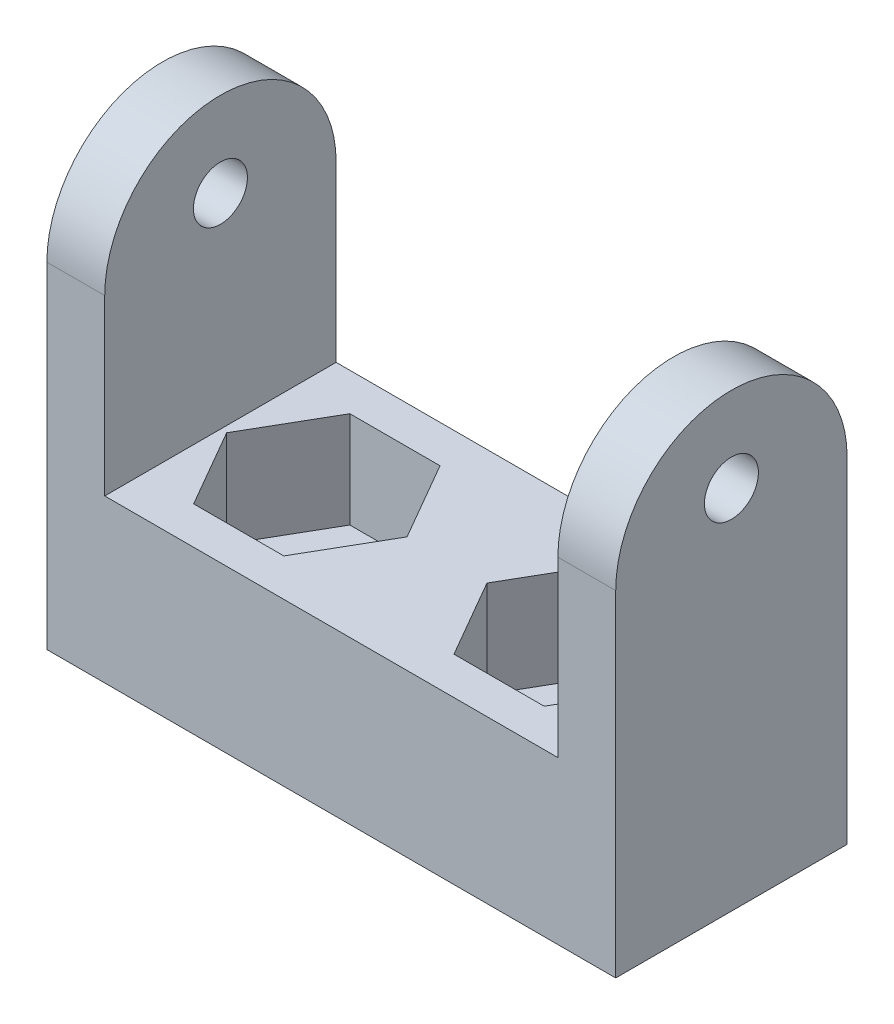
ISO-10303-21;
HEADER;
FILE_DESCRIPTION(('STEP AP214'),'2;1');
FILE_NAME('part.step','',(''),(''),'','','');
FILE_SCHEMA(('AUTOMOTIVE_DESIGN { 1 0 10303 214 1 1 1 1 }'));
ENDSEC;
DATA;
#1=APPLICATION_CONTEXT('core data for automotive mechanical design processes');
#2=APPLICATION_PROTOCOL_DEFINITION('international standard','automotive_design',2000,#1);
#3=PRODUCT_CONTEXT('',#1,'mechanical');
#4=PRODUCT('Part','Part','',(#3));
#5=PRODUCT_RELATED_PRODUCT_CATEGORY('part','',(#4));
#6=PRODUCT_DEFINITION_FORMATION('','',#4);
#7=PRODUCT_DEFINITION_CONTEXT('part definition',#1,'design');
#8=PRODUCT_DEFINITION('design','',#6,#7);
#9=PRODUCT_DEFINITION_SHAPE('','',#8);
#10=(LENGTH_UNIT() NAMED_UNIT(*) SI_UNIT(.MILLI.,.METRE.));
#11=(NAMED_UNIT(*) PLANE_ANGLE_UNIT() SI_UNIT($,.RADIAN.));
#12=(NAMED_UNIT(*) SI_UNIT($,.STERADIAN.) SOLID_ANGLE_UNIT());
#13=UNCERTAINTY_MEASURE_WITH_UNIT(LENGTH_MEASURE(1.E-05),#10,'distance_accuracy_value','');
#14=(GEOMETRIC_REPRESENTATION_CONTEXT(3) GLOBAL_UNCERTAINTY_ASSIGNED_CONTEXT((#13)) GLOBAL_UNIT_ASSIGNED_CONTEXT((#10,
#11,#12)) REPRESENTATION_CONTEXT('',''));
#15=CARTESIAN_POINT('',(0.,0.,0.));
#16=DIRECTION('',(0.,0.,1.));
#17=DIRECTION('',(1.,0.,0.));
#18=AXIS2_PLACEMENT_3D('',#15,#16,#17);
#19=CARTESIAN_POINT('',(0.,8.4,0.));
#20=DIRECTION('',(0.,1.,0.));
#21=DIRECTION('',(0.,0.,1.));
#22=AXIS2_PLACEMENT_3D('',#19,#20,#21);
#23=PLANE('',#22);
#24=DIRECTION('',(-1.,0.,0.));
#25=VECTOR('',#24,1.);
#26=CARTESIAN_POINT('',(-4.41173140978202,8.4,4.05));
#27=LINE('',#26,#25);
#28=CARTESIAN_POINT('',(-4.41173140978202,8.4,4.05));
#29=VERTEX_POINT('',#28);
#30=CARTESIAN_POINT('',(-9.08826859021799,8.4,4.05));
#31=VERTEX_POINT('',#30);
#32=EDGE_CURVE('E210',#29,#31,#27,.T.);
#33=ORIENTED_EDGE('',*,*,#32,.T.);
#34=DIRECTION('',(-0.5,0.,-0.866025403784439));
#35=VECTOR('',#34,1.);
#36=CARTESIAN_POINT('',(-9.08826859021799,8.4,4.05));
#37=LINE('',#36,#35);
#38=CARTESIAN_POINT('',(-11.426537180436,8.4,0.));
#39=VERTEX_POINT('',#38);
#40=EDGE_CURVE('E61',#31,#39,#37,.T.);
#41=ORIENTED_EDGE('',*,*,#40,.T.);
#42=DIRECTION('',(0.5,0.,-0.866025403784438));
#43=VECTOR('',#42,1.);
#44=CARTESIAN_POINT('',(-11.426537180436,8.4,0.));
#45=LINE('',#44,#43);
#46=CARTESIAN_POINT('',(-9.08826859021799,8.4,-4.05));
#47=VERTEX_POINT('',#46);
#48=EDGE_CURVE('E222',#39,#47,#45,.T.);
#49=ORIENTED_EDGE('',*,*,#48,.T.);
#50=DIRECTION('',(1.,0.,0.));
#51=VECTOR('',#50,1.);
#52=CARTESIAN_POINT('',(-9.08826859021799,8.4,-4.05));
#53=LINE('',#52,#51);
#54=CARTESIAN_POINT('',(-4.41173140978202,8.4,-4.05));
#55=VERTEX_POINT('',#54);
#56=EDGE_CURVE('E225',#47,#55,#53,.T.);
#57=ORIENTED_EDGE('',*,*,#56,.T.);
#58=DIRECTION('',(0.5,0.,0.866025403784439));
#59=VECTOR('',#58,1.);
#60=CARTESIAN_POINT('',(-4.41173140978202,8.4,-4.05));
#61=LINE('',#60,#59);
#62=CARTESIAN_POINT('',(-2.07346281956403,8.4,0.));
#63=VERTEX_POINT('',#62);
#64=EDGE_CURVE('E228',#55,#63,#61,.T.);
#65=ORIENTED_EDGE('',*,*,#64,.T.);
#66=DIRECTION('',(-0.5,0.,0.866025403784439));
#67=VECTOR('',#66,1.);
#68=CARTESIAN_POINT('',(-2.07346281956403,8.4,0.));
#69=LINE('',#68,#67);
#70=EDGE_CURVE('E231',#63,#29,#69,.T.);
#71=ORIENTED_EDGE('',*,*,#70,.T.);
#72=EDGE_LOOP('',(#33,#41,#49,#57,#65,#71));
#73=FACE_BOUND('',#72,.T.);
#74=DIRECTION('',(0.,0.,1.));
#75=VECTOR('',#74,1.);
#76=CARTESIAN_POINT('',(-11.75,8.4,6.));
#77=LINE('',#76,#75);
#78=CARTESIAN_POINT('',(-11.75,8.4,-6.));
#79=VERTEX_POINT('',#78);
#80=CARTESIAN_POINT('',(-11.75,8.4,6.));
#81=VERTEX_POINT('',#80);
#82=EDGE_CURVE('E263',#79,#81,#77,.T.);
#83=ORIENTED_EDGE('',*,*,#82,.T.);
#84=DIRECTION('',(1.,0.,0.));
#85=VECTOR('',#84,1.);
#86=CARTESIAN_POINT('',(11.75,8.4,6.));
#87=LINE('',#86,#85);
#88=CARTESIAN_POINT('',(11.75,8.4,6.));
#89=VERTEX_POINT('',#88);
#90=EDGE_CURVE('E266',#81,#89,#87,.T.);
#91=ORIENTED_EDGE('',*,*,#90,.T.);
#92=DIRECTION('',(0.,0.,-1.));
#93=VECTOR('',#92,1.);
#94=CARTESIAN_POINT('',(11.75,8.4,6.));
#95=LINE('',#94,#93);
#96=CARTESIAN_POINT('',(11.75,8.4,-6.));
#97=VERTEX_POINT('',#96);
#98=EDGE_CURVE('E269',#89,#97,#95,.T.);
#99=ORIENTED_EDGE('',*,*,#98,.T.);
#100=DIRECTION('',(-1.,0.,0.));
#101=VECTOR('',#100,1.);
#102=CARTESIAN_POINT('',(11.75,8.4,-6.));
#103=LINE('',#102,#101);
#104=EDGE_CURVE('E272',#97,#79,#103,.T.);
#105=ORIENTED_EDGE('',*,*,#104,.T.);
#106=EDGE_LOOP('',(#83,#91,#99,#105));
#107=FACE_BOUND('',#106,.T.);
#108=DIRECTION('',(-1.,0.,0.));
#109=VECTOR('',#108,1.);
#110=CARTESIAN_POINT('',(9.08826859021798,8.4,4.05));
#111=LINE('',#110,#109);
#112=CARTESIAN_POINT('',(9.08826859021798,8.4,4.05));
#113=VERTEX_POINT('',#112);
#114=CARTESIAN_POINT('',(4.41173140978201,8.4,4.05));
#115=VERTEX_POINT('',#114);
#116=EDGE_CURVE('E193',#113,#115,#111,.T.);
#117=ORIENTED_EDGE('',*,*,#116,.T.);
#118=DIRECTION('',(-0.5,0.,-0.866025403784439));
#119=VECTOR('',#118,1.);
#120=CARTESIAN_POINT('',(4.41173140978201,8.4,4.05));
#121=LINE('',#120,#119);
#122=CARTESIAN_POINT('',(2.07346281956403,8.4,0.));
#123=VERTEX_POINT('',#122);
#124=EDGE_CURVE('E53',#115,#123,#121,.T.);
#125=ORIENTED_EDGE('',*,*,#124,.T.);
#126=DIRECTION('',(0.5,0.,-0.866025403784439));
#127=VECTOR('',#126,1.);
#128=CARTESIAN_POINT('',(2.07346281956403,8.4,0.));
#129=LINE('',#128,#127);
#130=CARTESIAN_POINT('',(4.41173140978201,8.4,-4.05));
#131=VERTEX_POINT('',#130);
#132=EDGE_CURVE('E197',#123,#131,#129,.T.);
#133=ORIENTED_EDGE('',*,*,#132,.T.);
#134=DIRECTION('',(1.,0.,0.));
#135=VECTOR('',#134,1.);
#136=CARTESIAN_POINT('',(4.41173140978201,8.4,-4.05));
#137=LINE('',#136,#135);
#138=CARTESIAN_POINT('',(9.08826859021798,8.4,-4.05));
#139=VERTEX_POINT('',#138);
#140=EDGE_CURVE('E653',#131,#139,#137,.T.);
#141=ORIENTED_EDGE('',*,*,#140,.T.);
#142=DIRECTION('',(0.5,0.,0.866025403784439));
#143=VECTOR('',#142,1.);
#144=CARTESIAN_POINT('',(9.08826859021798,8.4,-4.05));
#145=LINE('',#144,#143);
#146=CARTESIAN_POINT('',(11.426537180436,8.4,0.));
#147=VERTEX_POINT('',#146);
#148=EDGE_CURVE('E650',#139,#147,#145,.T.);
#149=ORIENTED_EDGE('',*,*,#148,.T.);
#150=DIRECTION('',(-0.5,0.,0.866025403784439));
#151=VECTOR('',#150,1.);
#152=CARTESIAN_POINT('',(11.426537180436,8.4,0.));
#153=LINE('',#152,#151);
#154=EDGE_CURVE('E644',#147,#113,#153,.T.);
#155=ORIENTED_EDGE('',*,*,#154,.T.);
#156=EDGE_LOOP('',(#117,#125,#133,#141,#149,#155));
#157=FACE_BOUND('',#156,.T.);
#158=ADVANCED_FACE('F35',(#73,#107,#157),#23,.T.);
#159=CARTESIAN_POINT('',(0.,0.,0.));
#160=DIRECTION('',(0.,1.,0.));
#161=DIRECTION('',(0.,0.,1.));
#162=AXIS2_PLACEMENT_3D('',#159,#160,#161);
#163=PLANE('',#162);
#164=DIRECTION('',(0.,0.,-1.));
#165=VECTOR('',#164,1.);
#166=CARTESIAN_POINT('',(14.75,0.,-6.));
#167=LINE('',#166,#165);
#168=CARTESIAN_POINT('',(14.75,0.,6.));
#169=VERTEX_POINT('',#168);
#170=CARTESIAN_POINT('',(14.75,0.,-6.));
#171=VERTEX_POINT('',#170);
#172=EDGE_CURVE('E279',#169,#171,#167,.T.);
#173=ORIENTED_EDGE('',*,*,#172,.F.);
#174=DIRECTION('',(1.,0.,0.));
#175=VECTOR('',#174,1.);
#176=CARTESIAN_POINT('',(-14.75,0.,6.));
#177=LINE('',#176,#175);
#178=CARTESIAN_POINT('',(-14.75,0.,6.));
#179=VERTEX_POINT('',#178);
#180=EDGE_CURVE('E296',#179,#169,#177,.T.);
#181=ORIENTED_EDGE('',*,*,#180,.F.);
#182=DIRECTION('',(0.,0.,1.));
#183=VECTOR('',#182,1.);
#184=CARTESIAN_POINT('',(-14.75,0.,-6.));
#185=LINE('',#184,#183);
#186=CARTESIAN_POINT('',(-14.75,0.,-6.));
#187=VERTEX_POINT('',#186);
#188=EDGE_CURVE('E293',#187,#179,#185,.T.);
#189=ORIENTED_EDGE('',*,*,#188,.F.);
#190=DIRECTION('',(-1.,0.,0.));
#191=VECTOR('',#190,1.);
#192=CARTESIAN_POINT('',(-14.75,0.,-6.));
#193=LINE('',#192,#191);
#194=EDGE_CURVE('E290',#171,#187,#193,.T.);
#195=ORIENTED_EDGE('',*,*,#194,.F.);
#196=EDGE_LOOP('',(#173,#181,#189,#195));
#197=FACE_BOUND('',#196,.T.);
#198=CARTESIAN_POINT('',(-6.75,0.,0.));
#199=DIRECTION('',(0.,-1.,0.));
#200=DIRECTION('',(0.,0.,-1.));
#201=AXIS2_PLACEMENT_3D('',#198,#199,#200);
#202=CIRCLE('',#201,2.64999999999999);
#203=CARTESIAN_POINT('',(-6.75,0.,-2.64999999999999));
#204=VERTEX_POINT('',#203);
#205=EDGE_CURVE('E250',#204,#204,#202,.T.);
#206=ORIENTED_EDGE('',*,*,#205,.F.);
#207=EDGE_LOOP('',(#206));
#208=FACE_BOUND('',#207,.T.);
#209=CARTESIAN_POINT('',(6.75,0.,0.));
#210=DIRECTION('',(0.,-1.,0.));
#211=DIRECTION('',(0.,0.,-1.));
#212=AXIS2_PLACEMENT_3D('',#209,#210,#211);
#213=CIRCLE('',#212,2.64999999999999);
#214=CARTESIAN_POINT('',(6.75,0.,-2.64999999999999));
#215=VERTEX_POINT('',#214);
#216=EDGE_CURVE('E247',#215,#215,#213,.T.);
#217=ORIENTED_EDGE('',*,*,#216,.F.);
#218=EDGE_LOOP('',(#217));
#219=FACE_BOUND('',#218,.T.);
#220=ADVANCED_FACE('F350',(#197,#208,#219),#163,.F.);
#221=CARTESIAN_POINT('',(11.75,17.4,0.));
#222=DIRECTION('',(-1.,0.,0.));
#223=DIRECTION('',(0.,0.,1.));
#224=AXIS2_PLACEMENT_3D('',#221,#222,#223);
#225=CYLINDRICAL_SURFACE('',#224,6.);
#226=DIRECTION('',(1.,0.,0.));
#227=VECTOR('',#226,1.);
#228=CARTESIAN_POINT('',(11.75,17.4,-6.));
#229=LINE('',#228,#227);
#230=CARTESIAN_POINT('',(11.75,17.4,-6.));
#231=VERTEX_POINT('',#230);
#232=CARTESIAN_POINT('',(14.75,17.4,-6.));
#233=VERTEX_POINT('',#232);
#234=EDGE_CURVE('E319',#231,#233,#229,.T.);
#235=ORIENTED_EDGE('',*,*,#234,.F.);
#236=CARTESIAN_POINT('',(11.75,17.4,0.));
#237=DIRECTION('',(1.,0.,0.));
#238=DIRECTION('',(0.,0.,-1.));
#239=AXIS2_PLACEMENT_3D('',#236,#237,#238);
#240=CIRCLE('',#239,6.);
#241=CARTESIAN_POINT('',(11.75,17.4,6.));
#242=VERTEX_POINT('',#241);
#243=EDGE_CURVE('E45',#242,#231,#240,.F.);
#244=ORIENTED_EDGE('',*,*,#243,.F.);
#245=DIRECTION('',(1.,0.,0.));
#246=VECTOR('',#245,1.);
#247=CARTESIAN_POINT('',(11.75,17.4,6.));
#248=LINE('',#247,#246);
#249=CARTESIAN_POINT('',(14.75,17.4,6.));
#250=VERTEX_POINT('',#249);
#251=EDGE_CURVE('E322',#250,#242,#248,.F.);
#252=ORIENTED_EDGE('',*,*,#251,.F.);
#253=CARTESIAN_POINT('',(14.75,17.4,0.));
#254=DIRECTION('',(-1.,0.,0.));
#255=DIRECTION('',(0.,0.,1.));
#256=AXIS2_PLACEMENT_3D('',#253,#254,#255);
#257=CIRCLE('',#256,6.);
#258=EDGE_CURVE('E11',#233,#250,#257,.F.);
#259=ORIENTED_EDGE('',*,*,#258,.F.);
#260=EDGE_LOOP('',(#235,#244,#252,#259));
#261=FACE_BOUND('',#260,.T.);
#262=ADVANCED_FACE('F38',(#261),#225,.T.);
#263=CARTESIAN_POINT('',(-14.75,17.4,0.));
#264=DIRECTION('',(-1.,0.,0.));
#265=DIRECTION('',(0.,0.,1.));
#266=AXIS2_PLACEMENT_3D('',#263,#264,#265);
#267=CYLINDRICAL_SURFACE('',#266,6.);
#268=DIRECTION('',(1.,0.,0.));
#269=VECTOR('',#268,1.);
#270=CARTESIAN_POINT('',(-14.75,17.4,-6.));
#271=LINE('',#270,#269);
#272=CARTESIAN_POINT('',(-14.75,17.4,-6.));
#273=VERTEX_POINT('',#272);
#274=CARTESIAN_POINT('',(-11.75,17.4,-6.));
#275=VERTEX_POINT('',#274);
#276=EDGE_CURVE('E307',#273,#275,#271,.T.);
#277=ORIENTED_EDGE('',*,*,#276,.F.);
#278=CARTESIAN_POINT('',(-14.75,17.4,0.));
#279=DIRECTION('',(1.,0.,0.));
#280=DIRECTION('',(0.,0.,-1.));
#281=AXIS2_PLACEMENT_3D('',#278,#279,#280);
#282=CIRCLE('',#281,6.);
#283=CARTESIAN_POINT('',(-14.75,17.4,6.));
#284=VERTEX_POINT('',#283);
#285=EDGE_CURVE('E315',#284,#273,#282,.F.);
#286=ORIENTED_EDGE('',*,*,#285,.F.);
#287=DIRECTION('',(1.,0.,0.));
#288=VECTOR('',#287,1.);
#289=CARTESIAN_POINT('',(-14.75,17.4,6.));
#290=LINE('',#289,#288);
#291=CARTESIAN_POINT('',(-11.75,17.4,6.));
#292=VERTEX_POINT('',#291);
#293=EDGE_CURVE('E312',#292,#284,#290,.F.);
#294=ORIENTED_EDGE('',*,*,#293,.F.);
#295=CARTESIAN_POINT('',(-11.75,17.4,0.));
#296=DIRECTION('',(-1.,0.,0.));
#297=DIRECTION('',(0.,0.,1.));
#298=AXIS2_PLACEMENT_3D('',#295,#296,#297);
#299=CIRCLE('',#298,6.);
#300=EDGE_CURVE('E317',#275,#292,#299,.F.);
#301=ORIENTED_EDGE('',*,*,#300,.F.);
#302=EDGE_LOOP('',(#277,#286,#294,#301));
#303=FACE_BOUND('',#302,.T.);
#304=ADVANCED_FACE('F360',(#303),#267,.T.);
#305=CARTESIAN_POINT('',(14.75,23.4,-6.));
#306=DIRECTION('',(-1.,0.,0.));
#307=DIRECTION('',(0.,0.,1.));
#308=AXIS2_PLACEMENT_3D('',#305,#306,#307);
#309=PLANE('',#308);
#310=CARTESIAN_POINT('',(14.75,19.,0.));
#311=DIRECTION('',(-1.,0.,0.));
#312=DIRECTION('',(0.,0.,1.));
#313=AXIS2_PLACEMENT_3D('',#310,#311,#312);
#314=CIRCLE('',#313,1.4);
#315=CARTESIAN_POINT('',(14.75,19.,1.39999999999999));
#316=VERTEX_POINT('',#315);
#317=EDGE_CURVE('E254',#316,#316,#314,.T.);
#318=ORIENTED_EDGE('',*,*,#317,.T.);
#319=EDGE_LOOP('',(#318));
#320=FACE_BOUND('',#319,.T.);
#321=DIRECTION('',(0.,-1.,0.));
#322=VECTOR('',#321,1.);
#323=CARTESIAN_POINT('',(14.75,23.4,-6.));
#324=LINE('',#323,#322);
#325=EDGE_CURVE('E305',#233,#171,#324,.T.);
#326=ORIENTED_EDGE('',*,*,#325,.F.);
#327=ORIENTED_EDGE('',*,*,#258,.T.);
#328=DIRECTION('',(0.,-1.,0.));
#329=VECTOR('',#328,1.);
#330=CARTESIAN_POINT('',(14.75,23.4,6.));
#331=LINE('',#330,#329);
#332=EDGE_CURVE('E299',#250,#169,#331,.T.);
#333=ORIENTED_EDGE('',*,*,#332,.T.);
#334=ORIENTED_EDGE('',*,*,#172,.T.);
#335=EDGE_LOOP('',(#326,#327,#333,#334));
#336=FACE_BOUND('',#335,.T.);
#337=ADVANCED_FACE('F345',(#320,#336),#309,.F.);
#338=CARTESIAN_POINT('',(-14.75,23.4,-6.));
#339=DIRECTION('',(0.,0.,1.));
#340=DIRECTION('',(1.,0.,0.));
#341=AXIS2_PLACEMENT_3D('',#338,#339,#340);
#342=PLANE('',#341);
#343=DIRECTION('',(0.,1.,0.));
#344=VECTOR('',#343,1.);
#345=CARTESIAN_POINT('',(11.75,8.4,-6.));
#346=LINE('',#345,#344);
#347=EDGE_CURVE('E280',#97,#231,#346,.T.);
#348=ORIENTED_EDGE('',*,*,#347,.T.);
#349=ORIENTED_EDGE('',*,*,#234,.T.);
#350=ORIENTED_EDGE('',*,*,#325,.T.);
#351=ORIENTED_EDGE('',*,*,#194,.T.);
#352=DIRECTION('',(0.,-1.,0.));
#353=VECTOR('',#352,1.);
#354=CARTESIAN_POINT('',(-14.75,23.4,-6.));
#355=LINE('',#354,#353);
#356=EDGE_CURVE('E303',#273,#187,#355,.T.);
#357=ORIENTED_EDGE('',*,*,#356,.F.);
#358=ORIENTED_EDGE('',*,*,#276,.T.);
#359=DIRECTION('',(0.,1.,0.));
#360=VECTOR('',#359,1.);
#361=CARTESIAN_POINT('',(-11.75,8.4,-6.));
#362=LINE('',#361,#360);
#363=EDGE_CURVE('E276',#79,#275,#362,.T.);
#364=ORIENTED_EDGE('',*,*,#363,.F.);
#365=ORIENTED_EDGE('',*,*,#104,.F.);
#366=EDGE_LOOP('',(#348,#349,#350,#351,#357,#358,#364,#365));
#367=FACE_BOUND('',#366,.T.);
#368=ADVANCED_FACE('F334',(#367),#342,.F.);
#369=CARTESIAN_POINT('',(-14.75,23.4,-6.));
#370=DIRECTION('',(1.,0.,0.));
#371=DIRECTION('',(0.,0.,-1.));
#372=AXIS2_PLACEMENT_3D('',#369,#370,#371);
#373=PLANE('',#372);
#374=CARTESIAN_POINT('',(-14.75,19.,0.));
#375=DIRECTION('',(-1.,0.,0.));
#376=DIRECTION('',(0.,0.,1.));
#377=AXIS2_PLACEMENT_3D('',#374,#375,#376);
#378=CIRCLE('',#377,1.4);
#379=CARTESIAN_POINT('',(-14.75,19.,1.4));
#380=VERTEX_POINT('',#379);
#381=EDGE_CURVE('E253',#380,#380,#378,.T.);
#382=ORIENTED_EDGE('',*,*,#381,.F.);
#383=EDGE_LOOP('',(#382));
#384=FACE_BOUND('',#383,.T.);
#385=DIRECTION('',(0.,-1.,0.));
#386=VECTOR('',#385,1.);
#387=CARTESIAN_POINT('',(-14.75,23.4,6.));
#388=LINE('',#387,#386);
#389=EDGE_CURVE('E301',#284,#179,#388,.T.);
#390=ORIENTED_EDGE('',*,*,#389,.F.);
#391=ORIENTED_EDGE('',*,*,#285,.T.);
#392=ORIENTED_EDGE('',*,*,#356,.T.);
#393=ORIENTED_EDGE('',*,*,#188,.T.);
#394=EDGE_LOOP('',(#390,#391,#392,#393));
#395=FACE_BOUND('',#394,.T.);
#396=ADVANCED_FACE('F354',(#384,#395),#373,.F.);
#397=CARTESIAN_POINT('',(-14.75,23.4,6.));
#398=DIRECTION('',(0.,0.,-1.));
#399=DIRECTION('',(-1.,0.,0.));
#400=AXIS2_PLACEMENT_3D('',#397,#398,#399);
#401=PLANE('',#400);
#402=ORIENTED_EDGE('',*,*,#332,.F.);
#403=ORIENTED_EDGE('',*,*,#251,.T.);
#404=DIRECTION('',(0.,1.,0.));
#405=VECTOR('',#404,1.);
#406=CARTESIAN_POINT('',(11.75,8.4,6.));
#407=LINE('',#406,#405);
#408=EDGE_CURVE('E283',#89,#242,#407,.T.);
#409=ORIENTED_EDGE('',*,*,#408,.F.);
#410=ORIENTED_EDGE('',*,*,#90,.F.);
#411=DIRECTION('',(0.,1.,0.));
#412=VECTOR('',#411,1.);
#413=CARTESIAN_POINT('',(-11.75,8.4,6.));
#414=LINE('',#413,#412);
#415=EDGE_CURVE('E275',#81,#292,#414,.T.);
#416=ORIENTED_EDGE('',*,*,#415,.T.);
#417=ORIENTED_EDGE('',*,*,#293,.T.);
#418=ORIENTED_EDGE('',*,*,#389,.T.);
#419=ORIENTED_EDGE('',*,*,#180,.T.);
#420=EDGE_LOOP('',(#402,#403,#409,#410,#416,#417,#418,#419));
#421=FACE_BOUND('',#420,.T.);
#422=ADVANCED_FACE('F341',(#421),#401,.F.);
#423=CARTESIAN_POINT('',(-11.75,8.4,6.));
#424=DIRECTION('',(-1.,0.,0.));
#425=DIRECTION('',(0.,0.,1.));
#426=AXIS2_PLACEMENT_3D('',#423,#424,#425);
#427=PLANE('',#426);
#428=CARTESIAN_POINT('',(-11.75,19.,0.));
#429=DIRECTION('',(-1.,0.,0.));
#430=DIRECTION('',(0.,0.,1.));
#431=AXIS2_PLACEMENT_3D('',#428,#429,#430);
#432=CIRCLE('',#431,1.4);
#433=CARTESIAN_POINT('',(-11.75,19.,1.4));
#434=VERTEX_POINT('',#433);
#435=EDGE_CURVE('E260',#434,#434,#432,.T.);
#436=ORIENTED_EDGE('',*,*,#435,.T.);
#437=EDGE_LOOP('',(#436));
#438=FACE_BOUND('',#437,.T.);
#439=ORIENTED_EDGE('',*,*,#363,.T.);
#440=ORIENTED_EDGE('',*,*,#300,.T.);
#441=ORIENTED_EDGE('',*,*,#415,.F.);
#442=ORIENTED_EDGE('',*,*,#82,.F.);
#443=EDGE_LOOP('',(#439,#440,#441,#442));
#444=FACE_BOUND('',#443,.T.);
#445=ADVANCED_FACE('F358',(#438,#444),#427,.F.);
#446=CARTESIAN_POINT('',(11.75,8.4,6.));
#447=DIRECTION('',(1.,0.,0.));
#448=DIRECTION('',(0.,0.,-1.));
#449=AXIS2_PLACEMENT_3D('',#446,#447,#448);
#450=PLANE('',#449);
#451=CARTESIAN_POINT('',(11.75,19.,0.));
#452=DIRECTION('',(1.,0.,0.));
#453=DIRECTION('',(0.,0.,-1.));
#454=AXIS2_PLACEMENT_3D('',#451,#452,#453);
#455=CIRCLE('',#454,1.4);
#456=CARTESIAN_POINT('',(11.75,19.,1.39999999999999));
#457=VERTEX_POINT('',#456);
#458=EDGE_CURVE('E257',#457,#457,#455,.T.);
#459=ORIENTED_EDGE('',*,*,#458,.T.);
#460=EDGE_LOOP('',(#459));
#461=FACE_BOUND('',#460,.T.);
#462=ORIENTED_EDGE('',*,*,#408,.T.);
#463=ORIENTED_EDGE('',*,*,#243,.T.);
#464=ORIENTED_EDGE('',*,*,#347,.F.);
#465=ORIENTED_EDGE('',*,*,#98,.F.);
#466=EDGE_LOOP('',(#462,#463,#464,#465));
#467=FACE_BOUND('',#466,.T.);
#468=ADVANCED_FACE('F327',(#461,#467),#450,.F.);
#469=CARTESIAN_POINT('',(14.75,19.,0.));
#470=DIRECTION('',(-1.,0.,0.));
#471=DIRECTION('',(0.,0.,1.));
#472=AXIS2_PLACEMENT_3D('',#469,#470,#471);
#473=CYLINDRICAL_SURFACE('',#472,1.4);
#474=CARTESIAN_POINT('',(14.75,19.,1.39999999999999));
#475=CARTESIAN_POINT('',(14.71875,19.,1.39999999999999));
#476=CARTESIAN_POINT('',(14.6875,19.,1.39999999999999));
#477=CARTESIAN_POINT('',(14.625,19.,1.39999999999999));
#478=CARTESIAN_POINT('',(14.59375,19.,1.39999999999999));
#479=CARTESIAN_POINT('',(14.53125,19.,1.39999999999999));
#480=CARTESIAN_POINT('',(14.5,19.,1.39999999999999));
#481=CARTESIAN_POINT('',(14.4375,19.,1.39999999999999));
#482=CARTESIAN_POINT('',(14.40625,19.,1.39999999999999));
#483=CARTESIAN_POINT('',(14.34375,19.,1.39999999999999));
#484=CARTESIAN_POINT('',(14.3125,19.,1.39999999999999));
#485=CARTESIAN_POINT('',(14.25,19.,1.39999999999999));
#486=CARTESIAN_POINT('',(14.21875,19.,1.39999999999999));
#487=CARTESIAN_POINT('',(14.15625,19.,1.39999999999999));
#488=CARTESIAN_POINT('',(14.125,19.,1.39999999999999));
#489=CARTESIAN_POINT('',(14.0625,19.,1.39999999999999));
#490=CARTESIAN_POINT('',(14.03125,19.,1.39999999999999));
#491=CARTESIAN_POINT('',(13.96875,19.,1.39999999999999));
#492=CARTESIAN_POINT('',(13.9375,19.,1.39999999999999));
#493=CARTESIAN_POINT('',(13.875,19.,1.39999999999999));
#494=CARTESIAN_POINT('',(13.84375,19.,1.39999999999999));
#495=CARTESIAN_POINT('',(13.78125,19.,1.39999999999999));
#496=CARTESIAN_POINT('',(13.75,19.,1.39999999999999));
#497=CARTESIAN_POINT('',(13.6875,19.,1.39999999999999));
#498=CARTESIAN_POINT('',(13.65625,19.,1.39999999999999));
#499=CARTESIAN_POINT('',(13.59375,19.,1.39999999999999));
#500=CARTESIAN_POINT('',(13.5625,19.,1.39999999999999));
#501=CARTESIAN_POINT('',(13.5,19.,1.39999999999999));
#502=CARTESIAN_POINT('',(13.46875,19.,1.39999999999999));
#503=CARTESIAN_POINT('',(13.40625,19.,1.39999999999999));
#504=CARTESIAN_POINT('',(13.375,19.,1.39999999999999));
#505=CARTESIAN_POINT('',(13.3125,19.,1.39999999999999));
#506=CARTESIAN_POINT('',(13.28125,19.,1.39999999999999));
#507=CARTESIAN_POINT('',(13.21875,19.,1.39999999999999));
#508=CARTESIAN_POINT('',(13.1875,19.,1.39999999999999));
#509=CARTESIAN_POINT('',(13.125,19.,1.39999999999999));
#510=CARTESIAN_POINT('',(13.09375,19.,1.39999999999999));
#511=CARTESIAN_POINT('',(13.03125,19.,1.39999999999999));
#512=CARTESIAN_POINT('',(13.,19.,1.39999999999999));
#513=CARTESIAN_POINT('',(12.9375,19.,1.39999999999999));
#514=CARTESIAN_POINT('',(12.90625,19.,1.39999999999999));
#515=CARTESIAN_POINT('',(12.84375,19.,1.39999999999999));
#516=CARTESIAN_POINT('',(12.8125,19.,1.39999999999999));
#517=CARTESIAN_POINT('',(12.75,19.,1.39999999999999));
#518=CARTESIAN_POINT('',(12.71875,19.,1.39999999999999));
#519=CARTESIAN_POINT('',(12.65625,19.,1.39999999999999));
#520=CARTESIAN_POINT('',(12.625,19.,1.39999999999999));
#521=CARTESIAN_POINT('',(12.5625,19.,1.39999999999999));
#522=CARTESIAN_POINT('',(12.53125,19.,1.39999999999999));
#523=CARTESIAN_POINT('',(12.46875,19.,1.39999999999999));
#524=CARTESIAN_POINT('',(12.4375,19.,1.39999999999999));
#525=CARTESIAN_POINT('',(12.375,19.,1.39999999999999));
#526=CARTESIAN_POINT('',(12.34375,19.,1.39999999999999));
#527=CARTESIAN_POINT('',(12.28125,19.,1.39999999999999));
#528=CARTESIAN_POINT('',(12.25,19.,1.39999999999999));
#529=CARTESIAN_POINT('',(12.1875,19.,1.39999999999999));
#530=CARTESIAN_POINT('',(12.15625,19.,1.39999999999999));
#531=CARTESIAN_POINT('',(12.09375,19.,1.39999999999999));
#532=CARTESIAN_POINT('',(12.0625,19.,1.39999999999999));
#533=CARTESIAN_POINT('',(12.,19.,1.39999999999999));
#534=CARTESIAN_POINT('',(11.96875,19.,1.39999999999999));
#535=CARTESIAN_POINT('',(11.90625,19.,1.39999999999999));
#536=CARTESIAN_POINT('',(11.875,19.,1.39999999999999));
#537=CARTESIAN_POINT('',(11.8125,19.,1.39999999999999));
#538=CARTESIAN_POINT('',(11.78125,19.,1.39999999999999));
#539=CARTESIAN_POINT('',(11.75,19.,1.39999999999999));
#540=B_SPLINE_CURVE_WITH_KNOTS('',3,(#474,#475,#476,#477,#478,#479,#480,#481,#482,#483,#484,
#485,#486,#487,#488,#489,#490,#491,#492,#493,#494,#495,#496,#497,#498,#499,#500,#501,#502,#503,
#504,#505,#506,#507,#508,#509,#510,#511,#512,#513,#514,#515,#516,#517,#518,#519,#520,#521,#522,
#523,#524,#525,#526,#527,#528,#529,#530,#531,#532,#533,#534,#535,#536,#537,#538,#539),
.UNSPECIFIED.,.F.,.F.,(4,2,2,2,2,2,2,2,2,2,2,2,2,2,2,2,2,2,2,2,2,2,2,2,2,2,2,2,2,2,2,2,4),(0.,
0.0937500000000001,0.1875,0.28125,0.375,0.46875,0.5625,0.656250000000001,0.750000000000001,
0.843750000000001,0.937500000000001,1.03125,1.125,1.21875,1.3125,1.40625,1.5,1.59375,1.6875,
1.78125,1.875,1.96875,2.0625,2.15625,2.25,2.34375,2.4375,2.53125,2.625,2.71875,2.8125,2.90625,
3.),.UNSPECIFIED.);
#541=EDGE_CURVE('BSEAM382',#316,#457,#540,.T.);
#542=ORIENTED_EDGE('',*,*,#317,.F.);
#543=ORIENTED_EDGE('',*,*,#458,.F.);
#544=ORIENTED_EDGE('',*,*,#541,.T.);
#545=ORIENTED_EDGE('',*,*,#541,.F.);
#546=EDGE_LOOP('',(#542,#544,#543,#545));
#547=FACE_BOUND('',#546,.T.);
#548=ADVANCED_FACE('F382',(#547),#473,.F.);
#549=CARTESIAN_POINT('',(-14.75,19.,1.4));
#550=CARTESIAN_POINT('',(-14.71875,19.,1.4));
#551=CARTESIAN_POINT('',(-14.6875,19.,1.4));
#552=CARTESIAN_POINT('',(-14.625,19.,1.4));
#553=CARTESIAN_POINT('',(-14.59375,19.,1.4));
#554=CARTESIAN_POINT('',(-14.53125,19.,1.4));
#555=CARTESIAN_POINT('',(-14.5,19.,1.4));
#556=CARTESIAN_POINT('',(-14.4375,19.,1.4));
#557=CARTESIAN_POINT('',(-14.40625,19.,1.4));
#558=CARTESIAN_POINT('',(-14.34375,19.,1.4));
#559=CARTESIAN_POINT('',(-14.3125,19.,1.4));
#560=CARTESIAN_POINT('',(-14.25,19.,1.4));
#561=CARTESIAN_POINT('',(-14.21875,19.,1.4));
#562=CARTESIAN_POINT('',(-14.15625,19.,1.4));
#563=CARTESIAN_POINT('',(-14.125,19.,1.4));
#564=CARTESIAN_POINT('',(-14.0625,19.,1.4));
#565=CARTESIAN_POINT('',(-14.03125,19.,1.4));
#566=CARTESIAN_POINT('',(-13.96875,19.,1.4));
#567=CARTESIAN_POINT('',(-13.9375,19.,1.4));
#568=CARTESIAN_POINT('',(-13.875,19.,1.4));
#569=CARTESIAN_POINT('',(-13.84375,19.,1.4));
#570=CARTESIAN_POINT('',(-13.78125,19.,1.4));
#571=CARTESIAN_POINT('',(-13.75,19.,1.4));
#572=CARTESIAN_POINT('',(-13.6875,19.,1.4));
#573=CARTESIAN_POINT('',(-13.65625,19.,1.4));
#574=CARTESIAN_POINT('',(-13.59375,19.,1.4));
#575=CARTESIAN_POINT('',(-13.5625,19.,1.4));
#576=CARTESIAN_POINT('',(-13.5,19.,1.4));
#577=CARTESIAN_POINT('',(-13.46875,19.,1.4));
#578=CARTESIAN_POINT('',(-13.40625,19.,1.4));
#579=CARTESIAN_POINT('',(-13.375,19.,1.4));
#580=CARTESIAN_POINT('',(-13.3125,19.,1.4));
#581=CARTESIAN_POINT('',(-13.28125,19.,1.4));
#582=CARTESIAN_POINT('',(-13.21875,19.,1.4));
#583=CARTESIAN_POINT('',(-13.1875,19.,1.4));
#584=CARTESIAN_POINT('',(-13.125,19.,1.4));
#585=CARTESIAN_POINT('',(-13.09375,19.,1.4));
#586=CARTESIAN_POINT('',(-13.03125,19.,1.4));
#587=CARTESIAN_POINT('',(-13.,19.,1.4));
#588=CARTESIAN_POINT('',(-12.9375,19.,1.4));
#589=CARTESIAN_POINT('',(-12.90625,19.,1.4));
#590=CARTESIAN_POINT('',(-12.84375,19.,1.4));
#591=CARTESIAN_POINT('',(-12.8125,19.,1.4));
#592=CARTESIAN_POINT('',(-12.75,19.,1.4));
#593=CARTESIAN_POINT('',(-12.71875,19.,1.4));
#594=CARTESIAN_POINT('',(-12.65625,19.,1.4));
#595=CARTESIAN_POINT('',(-12.625,19.,1.4));
#596=CARTESIAN_POINT('',(-12.5625,19.,1.4));
#597=CARTESIAN_POINT('',(-12.53125,19.,1.4));
#598=CARTESIAN_POINT('',(-12.46875,19.,1.4));
#599=CARTESIAN_POINT('',(-12.4375,19.,1.4));
#600=CARTESIAN_POINT('',(-12.375,19.,1.4));
#601=CARTESIAN_POINT('',(-12.34375,19.,1.4));
#602=CARTESIAN_POINT('',(-12.28125,19.,1.4));
#603=CARTESIAN_POINT('',(-12.25,19.,1.4));
#604=CARTESIAN_POINT('',(-12.1875,19.,1.4));
#605=CARTESIAN_POINT('',(-12.15625,19.,1.4));
#606=CARTESIAN_POINT('',(-12.09375,19.,1.4));
#607=CARTESIAN_POINT('',(-12.0625,19.,1.4));
#608=CARTESIAN_POINT('',(-12.,19.,1.4));
#609=CARTESIAN_POINT('',(-11.96875,19.,1.4));
#610=CARTESIAN_POINT('',(-11.90625,19.,1.4));
#611=CARTESIAN_POINT('',(-11.875,19.,1.4));
#612=CARTESIAN_POINT('',(-11.8125,19.,1.4));
#613=CARTESIAN_POINT('',(-11.78125,19.,1.4));
#614=CARTESIAN_POINT('',(-11.75,19.,1.4));
#615=B_SPLINE_CURVE_WITH_KNOTS('',3,(#549,#550,#551,#552,#553,#554,#555,#556,#557,#558,#559,
#560,#561,#562,#563,#564,#565,#566,#567,#568,#569,#570,#571,#572,#573,#574,#575,#576,#577,#578,
#579,#580,#581,#582,#583,#584,#585,#586,#587,#588,#589,#590,#591,#592,#593,#594,#595,#596,#597,
#598,#599,#600,#601,#602,#603,#604,#605,#606,#607,#608,#609,#610,#611,#612,#613,#614),
.UNSPECIFIED.,.F.,.F.,(4,2,2,2,2,2,2,2,2,2,2,2,2,2,2,2,2,2,2,2,2,2,2,2,2,2,2,2,2,2,2,2,4),(0.,
0.0937500000000001,0.1875,0.28125,0.375,0.46875,0.5625,0.656250000000001,0.750000000000001,
0.843750000000001,0.937500000000001,1.03125,1.125,1.21875,1.3125,1.40625,1.5,1.59375,1.6875,
1.78125,1.875,1.96875,2.0625,2.15625,2.25,2.34375,2.4375,2.53125,2.625,2.71875,2.8125,2.90625,
3.),.UNSPECIFIED.);
#616=EDGE_CURVE('BSEAM378',#380,#434,#615,.T.);
#617=ORIENTED_EDGE('',*,*,#381,.T.);
#618=ORIENTED_EDGE('',*,*,#435,.F.);
#619=ORIENTED_EDGE('',*,*,#616,.T.);
#620=ORIENTED_EDGE('',*,*,#616,.F.);
#621=EDGE_LOOP('',(#617,#619,#618,#620));
#622=FACE_BOUND('',#621,.T.);
#623=ADVANCED_FACE('F378',(#622),#473,.F.);
#624=CARTESIAN_POINT('',(-6.75,0.,0.));
#625=DIRECTION('',(0.,-1.,0.));
#626=DIRECTION('',(0.,0.,-1.));
#627=AXIS2_PLACEMENT_3D('',#624,#625,#626);
#628=CYLINDRICAL_SURFACE('',#627,2.64999999999999);
#629=CARTESIAN_POINT('',(-6.75,3.4,0.));
#630=DIRECTION('',(0.,-1.,0.));
#631=DIRECTION('',(0.,0.,-1.));
#632=AXIS2_PLACEMENT_3D('',#629,#630,#631);
#633=CIRCLE('',#632,2.64999999999999);
#634=CARTESIAN_POINT('',(-6.75,3.4,-2.64999999999999));
#635=VERTEX_POINT('',#634);
#636=EDGE_CURVE('E40',#635,#635,#633,.F.);
#637=ORIENTED_EDGE('',*,*,#636,.T.);
#638=EDGE_LOOP('',(#637));
#639=FACE_BOUND('',#638,.T.);
#640=ORIENTED_EDGE('',*,*,#205,.T.);
#641=EDGE_LOOP('',(#640));
#642=FACE_BOUND('',#641,.T.);
#643=ADVANCED_FACE('F427',(#639,#642),#628,.F.);
#644=CARTESIAN_POINT('',(6.75,0.,0.));
#645=DIRECTION('',(0.,-1.,0.));
#646=DIRECTION('',(0.,0.,-1.));
#647=AXIS2_PLACEMENT_3D('',#644,#645,#646);
#648=CYLINDRICAL_SURFACE('',#647,2.64999999999999);
#649=CARTESIAN_POINT('',(6.75,3.4,0.));
#650=DIRECTION('',(0.,-1.,0.));
#651=DIRECTION('',(0.,0.,-1.));
#652=AXIS2_PLACEMENT_3D('',#649,#650,#651);
#653=CIRCLE('',#652,2.64999999999999);
#654=CARTESIAN_POINT('',(6.75,3.4,-2.64999999999999));
#655=VERTEX_POINT('',#654);
#656=EDGE_CURVE('E198',#655,#655,#653,.F.);
#657=ORIENTED_EDGE('',*,*,#656,.T.);
#658=EDGE_LOOP('',(#657));
#659=FACE_BOUND('',#658,.T.);
#660=ORIENTED_EDGE('',*,*,#216,.T.);
#661=EDGE_LOOP('',(#660));
#662=FACE_BOUND('',#661,.T.);
#663=ADVANCED_FACE('F434',(#659,#662),#648,.F.);
#664=CARTESIAN_POINT('',(0.,3.4,0.));
#665=DIRECTION('',(0.,-1.,0.));
#666=DIRECTION('',(0.,0.,-1.));
#667=AXIS2_PLACEMENT_3D('',#664,#665,#666);
#668=PLANE('',#667);
#669=DIRECTION('',(-0.5,0.,-0.866025403784439));
#670=VECTOR('',#669,1.);
#671=CARTESIAN_POINT('',(4.41173140978201,3.4,4.05));
#672=LINE('',#671,#670);
#673=CARTESIAN_POINT('',(4.41173140978201,3.4,4.05));
#674=VERTEX_POINT('',#673);
#675=CARTESIAN_POINT('',(2.07346281956403,3.4,0.));
#676=VERTEX_POINT('',#675);
#677=EDGE_CURVE('E183',#674,#676,#672,.T.);
#678=ORIENTED_EDGE('',*,*,#677,.F.);
#679=DIRECTION('',(-1.,0.,0.));
#680=VECTOR('',#679,1.);
#681=CARTESIAN_POINT('',(9.08826859021798,3.4,4.05));
#682=LINE('',#681,#680);
#683=CARTESIAN_POINT('',(9.08826859021798,3.4,4.05));
#684=VERTEX_POINT('',#683);
#685=EDGE_CURVE('E658',#684,#674,#682,.T.);
#686=ORIENTED_EDGE('',*,*,#685,.F.);
#687=DIRECTION('',(-0.5,0.,0.866025403784439));
#688=VECTOR('',#687,1.);
#689=CARTESIAN_POINT('',(11.426537180436,3.4,0.));
#690=LINE('',#689,#688);
#691=CARTESIAN_POINT('',(11.426537180436,3.4,0.));
#692=VERTEX_POINT('',#691);
#693=EDGE_CURVE('E667',#692,#684,#690,.T.);
#694=ORIENTED_EDGE('',*,*,#693,.F.);
#695=DIRECTION('',(0.5,0.,0.866025403784439));
#696=VECTOR('',#695,1.);
#697=CARTESIAN_POINT('',(9.08826859021798,3.4,-4.05));
#698=LINE('',#697,#696);
#699=CARTESIAN_POINT('',(9.08826859021798,3.4,-4.05));
#700=VERTEX_POINT('',#699);
#701=EDGE_CURVE('E669',#700,#692,#698,.T.);
#702=ORIENTED_EDGE('',*,*,#701,.F.);
#703=DIRECTION('',(1.,0.,0.));
#704=VECTOR('',#703,1.);
#705=CARTESIAN_POINT('',(4.41173140978201,3.4,-4.05));
#706=LINE('',#705,#704);
#707=CARTESIAN_POINT('',(4.41173140978201,3.4,-4.05));
#708=VERTEX_POINT('',#707);
#709=EDGE_CURVE('E185',#708,#700,#706,.T.);
#710=ORIENTED_EDGE('',*,*,#709,.F.);
#711=DIRECTION('',(0.5,0.,-0.866025403784439));
#712=VECTOR('',#711,1.);
#713=CARTESIAN_POINT('',(2.07346281956403,3.4,0.));
#714=LINE('',#713,#712);
#715=EDGE_CURVE('E178',#676,#708,#714,.T.);
#716=ORIENTED_EDGE('',*,*,#715,.F.);
#717=EDGE_LOOP('',(#678,#686,#694,#702,#710,#716));
#718=FACE_BOUND('',#717,.T.);
#719=ORIENTED_EDGE('',*,*,#656,.F.);
#720=EDGE_LOOP('',(#719));
#721=FACE_BOUND('',#720,.T.);
#722=ADVANCED_FACE('F180',(#718,#721),#668,.F.);
#723=CARTESIAN_POINT('',(4.41173140978201,3.4,4.05));
#724=DIRECTION('',(0.866025403784439,0.,-0.5));
#725=DIRECTION('',(-0.5,0.,-0.866025403784439));
#726=AXIS2_PLACEMENT_3D('',#723,#724,#725);
#727=PLANE('',#726);
#728=ORIENTED_EDGE('',*,*,#124,.F.);
#729=DIRECTION('',(0.,1.,0.));
#730=VECTOR('',#729,1.);
#731=CARTESIAN_POINT('',(4.41173140978201,3.4,4.05));
#732=LINE('',#731,#730);
#733=EDGE_CURVE('E192',#674,#115,#732,.T.);
#734=ORIENTED_EDGE('',*,*,#733,.F.);
#735=ORIENTED_EDGE('',*,*,#677,.T.);
#736=DIRECTION('',(0.,1.,0.));
#737=VECTOR('',#736,1.);
#738=CARTESIAN_POINT('',(2.07346281956403,3.4,0.));
#739=LINE('',#738,#737);
#740=EDGE_CURVE('E191',#676,#123,#739,.T.);
#741=ORIENTED_EDGE('',*,*,#740,.T.);
#742=EDGE_LOOP('',(#728,#734,#735,#741));
#743=FACE_BOUND('',#742,.T.);
#744=ADVANCED_FACE('F190',(#743),#727,.T.);
#745=CARTESIAN_POINT('',(2.07346281956403,3.4,0.));
#746=DIRECTION('',(0.866025403784439,0.,0.5));
#747=DIRECTION('',(0.5,0.,-0.866025403784439));
#748=AXIS2_PLACEMENT_3D('',#745,#746,#747);
#749=PLANE('',#748);
#750=ORIENTED_EDGE('',*,*,#132,.F.);
#751=ORIENTED_EDGE('',*,*,#740,.F.);
#752=ORIENTED_EDGE('',*,*,#715,.T.);
#753=DIRECTION('',(0.,1.,0.));
#754=VECTOR('',#753,1.);
#755=CARTESIAN_POINT('',(4.41173140978201,3.4,-4.05));
#756=LINE('',#755,#754);
#757=EDGE_CURVE('E199',#708,#131,#756,.T.);
#758=ORIENTED_EDGE('',*,*,#757,.T.);
#759=EDGE_LOOP('',(#750,#751,#752,#758));
#760=FACE_BOUND('',#759,.T.);
#761=ADVANCED_FACE('F195',(#760),#749,.T.);
#762=CARTESIAN_POINT('',(4.41173140978201,3.4,-4.05));
#763=DIRECTION('',(0.,0.,1.));
#764=DIRECTION('',(1.,0.,0.));
#765=AXIS2_PLACEMENT_3D('',#762,#763,#764);
#766=PLANE('',#765);
#767=ORIENTED_EDGE('',*,*,#140,.F.);
#768=ORIENTED_EDGE('',*,*,#757,.F.);
#769=ORIENTED_EDGE('',*,*,#709,.T.);
#770=DIRECTION('',(0.,1.,0.));
#771=VECTOR('',#770,1.);
#772=CARTESIAN_POINT('',(9.08826859021798,3.4,-4.05));
#773=LINE('',#772,#771);
#774=EDGE_CURVE('E202',#700,#139,#773,.T.);
#775=ORIENTED_EDGE('',*,*,#774,.T.);
#776=EDGE_LOOP('',(#767,#768,#769,#775));
#777=FACE_BOUND('',#776,.T.);
#778=ADVANCED_FACE('F460',(#777),#766,.T.);
#779=CARTESIAN_POINT('',(9.08826859021798,3.4,-4.05));
#780=DIRECTION('',(-0.866025403784439,0.,0.5));
#781=DIRECTION('',(0.5,0.,0.866025403784439));
#782=AXIS2_PLACEMENT_3D('',#779,#780,#781);
#783=PLANE('',#782);
#784=ORIENTED_EDGE('',*,*,#148,.F.);
#785=ORIENTED_EDGE('',*,*,#774,.F.);
#786=ORIENTED_EDGE('',*,*,#701,.T.);
#787=DIRECTION('',(0.,1.,0.));
#788=VECTOR('',#787,1.);
#789=CARTESIAN_POINT('',(11.426537180436,3.4,0.));
#790=LINE('',#789,#788);
#791=EDGE_CURVE('E660',#692,#147,#790,.T.);
#792=ORIENTED_EDGE('',*,*,#791,.T.);
#793=EDGE_LOOP('',(#784,#785,#786,#792));
#794=FACE_BOUND('',#793,.T.);
#795=ADVANCED_FACE('F467',(#794),#783,.T.);
#796=CARTESIAN_POINT('',(11.426537180436,3.4,0.));
#797=DIRECTION('',(-0.866025403784439,0.,-0.5));
#798=DIRECTION('',(-0.5,0.,0.866025403784439));
#799=AXIS2_PLACEMENT_3D('',#796,#797,#798);
#800=PLANE('',#799);
#801=ORIENTED_EDGE('',*,*,#154,.F.);
#802=ORIENTED_EDGE('',*,*,#791,.F.);
#803=ORIENTED_EDGE('',*,*,#693,.T.);
#804=DIRECTION('',(0.,1.,0.));
#805=VECTOR('',#804,1.);
#806=CARTESIAN_POINT('',(9.08826859021798,3.4,4.05));
#807=LINE('',#806,#805);
#808=EDGE_CURVE('E643',#684,#113,#807,.T.);
#809=ORIENTED_EDGE('',*,*,#808,.T.);
#810=EDGE_LOOP('',(#801,#802,#803,#809));
#811=FACE_BOUND('',#810,.T.);
#812=ADVANCED_FACE('F475',(#811),#800,.T.);
#813=CARTESIAN_POINT('',(9.08826859021798,3.4,4.05));
#814=DIRECTION('',(0.,0.,-1.));
#815=DIRECTION('',(-1.,0.,0.));
#816=AXIS2_PLACEMENT_3D('',#813,#814,#815);
#817=PLANE('',#816);
#818=ORIENTED_EDGE('',*,*,#116,.F.);
#819=ORIENTED_EDGE('',*,*,#808,.F.);
#820=ORIENTED_EDGE('',*,*,#685,.T.);
#821=ORIENTED_EDGE('',*,*,#733,.T.);
#822=EDGE_LOOP('',(#818,#819,#820,#821));
#823=FACE_BOUND('',#822,.T.);
#824=ADVANCED_FACE('F483',(#823),#817,.T.);
#825=CARTESIAN_POINT('',(0.,3.4,0.));
#826=DIRECTION('',(0.,-1.,0.));
#827=DIRECTION('',(0.,0.,-1.));
#828=AXIS2_PLACEMENT_3D('',#825,#826,#827);
#829=PLANE('',#828);
#830=DIRECTION('',(-0.5,0.,-0.866025403784439));
#831=VECTOR('',#830,1.);
#832=CARTESIAN_POINT('',(-9.08826859021799,3.4,4.05));
#833=LINE('',#832,#831);
#834=CARTESIAN_POINT('',(-9.08826859021799,3.4,4.05));
#835=VERTEX_POINT('',#834);
#836=CARTESIAN_POINT('',(-11.426537180436,3.4,0.));
#837=VERTEX_POINT('',#836);
#838=EDGE_CURVE('E206',#835,#837,#833,.T.);
#839=ORIENTED_EDGE('',*,*,#838,.F.);
#840=DIRECTION('',(-1.,0.,0.));
#841=VECTOR('',#840,1.);
#842=CARTESIAN_POINT('',(-4.41173140978202,3.4,4.05));
#843=LINE('',#842,#841);
#844=CARTESIAN_POINT('',(-4.41173140978202,3.4,4.05));
#845=VERTEX_POINT('',#844);
#846=EDGE_CURVE('E218',#845,#835,#843,.T.);
#847=ORIENTED_EDGE('',*,*,#846,.F.);
#848=DIRECTION('',(-0.5,0.,0.866025403784439));
#849=VECTOR('',#848,1.);
#850=CARTESIAN_POINT('',(-2.07346281956403,3.4,0.));
#851=LINE('',#850,#849);
#852=CARTESIAN_POINT('',(-2.07346281956403,3.4,0.));
#853=VERTEX_POINT('',#852);
#854=EDGE_CURVE('E216',#853,#845,#851,.T.);
#855=ORIENTED_EDGE('',*,*,#854,.F.);
#856=DIRECTION('',(0.5,0.,0.866025403784439));
#857=VECTOR('',#856,1.);
#858=CARTESIAN_POINT('',(-4.41173140978202,3.4,-4.05));
#859=LINE('',#858,#857);
#860=CARTESIAN_POINT('',(-4.41173140978202,3.4,-4.05));
#861=VERTEX_POINT('',#860);
#862=EDGE_CURVE('E214',#861,#853,#859,.T.);
#863=ORIENTED_EDGE('',*,*,#862,.F.);
#864=DIRECTION('',(1.,0.,0.));
#865=VECTOR('',#864,1.);
#866=CARTESIAN_POINT('',(-9.08826859021799,3.4,-4.05));
#867=LINE('',#866,#865);
#868=CARTESIAN_POINT('',(-9.08826859021799,3.4,-4.05));
#869=VERTEX_POINT('',#868);
#870=EDGE_CURVE('E212',#869,#861,#867,.T.);
#871=ORIENTED_EDGE('',*,*,#870,.F.);
#872=DIRECTION('',(0.5,0.,-0.866025403784438));
#873=VECTOR('',#872,1.);
#874=CARTESIAN_POINT('',(-11.426537180436,3.4,0.));
#875=LINE('',#874,#873);
#876=EDGE_CURVE('E209',#837,#869,#875,.T.);
#877=ORIENTED_EDGE('',*,*,#876,.F.);
#878=EDGE_LOOP('',(#839,#847,#855,#863,#871,#877));
#879=FACE_BOUND('',#878,.T.);
#880=ORIENTED_EDGE('',*,*,#636,.F.);
#881=EDGE_LOOP('',(#880));
#882=FACE_BOUND('',#881,.T.);
#883=ADVANCED_FACE('F491',(#879,#882),#829,.F.);
#884=CARTESIAN_POINT('',(-9.08826859021799,3.4,4.05));
#885=DIRECTION('',(0.866025403784439,0.,-0.5));
#886=DIRECTION('',(-0.5,0.,-0.866025403784439));
#887=AXIS2_PLACEMENT_3D('',#884,#885,#886);
#888=PLANE('',#887);
#889=ORIENTED_EDGE('',*,*,#40,.F.);
#890=DIRECTION('',(0.,1.,0.));
#891=VECTOR('',#890,1.);
#892=CARTESIAN_POINT('',(-9.08826859021799,3.4,4.05));
#893=LINE('',#892,#891);
#894=EDGE_CURVE('E220',#835,#31,#893,.T.);
#895=ORIENTED_EDGE('',*,*,#894,.F.);
#896=ORIENTED_EDGE('',*,*,#838,.T.);
#897=DIRECTION('',(0.,1.,0.));
#898=VECTOR('',#897,1.);
#899=CARTESIAN_POINT('',(-11.426537180436,3.4,0.));
#900=LINE('',#899,#898);
#901=EDGE_CURVE('E245',#837,#39,#900,.T.);
#902=ORIENTED_EDGE('',*,*,#901,.T.);
#903=EDGE_LOOP('',(#889,#895,#896,#902));
#904=FACE_BOUND('',#903,.T.);
#905=ADVANCED_FACE('F499',(#904),#888,.T.);
#906=CARTESIAN_POINT('',(-11.426537180436,3.4,0.));
#907=DIRECTION('',(0.866025403784439,0.,0.5));
#908=DIRECTION('',(0.5,0.,-0.866025403784439));
#909=AXIS2_PLACEMENT_3D('',#906,#907,#908);
#910=PLANE('',#909);
#911=ORIENTED_EDGE('',*,*,#48,.F.);
#912=ORIENTED_EDGE('',*,*,#901,.F.);
#913=ORIENTED_EDGE('',*,*,#876,.T.);
#914=DIRECTION('',(0.,1.,0.));
#915=VECTOR('',#914,1.);
#916=CARTESIAN_POINT('',(-9.08826859021799,3.4,-4.05));
#917=LINE('',#916,#915);
#918=EDGE_CURVE('E243',#869,#47,#917,.T.);
#919=ORIENTED_EDGE('',*,*,#918,.T.);
#920=EDGE_LOOP('',(#911,#912,#913,#919));
#921=FACE_BOUND('',#920,.T.);
#922=ADVANCED_FACE('F507',(#921),#910,.T.);
#923=CARTESIAN_POINT('',(-9.08826859021799,3.4,-4.05));
#924=DIRECTION('',(0.,0.,1.));
#925=DIRECTION('',(1.,0.,0.));
#926=AXIS2_PLACEMENT_3D('',#923,#924,#925);
#927=PLANE('',#926);
#928=ORIENTED_EDGE('',*,*,#56,.F.);
#929=ORIENTED_EDGE('',*,*,#918,.F.);
#930=ORIENTED_EDGE('',*,*,#870,.T.);
#931=DIRECTION('',(0.,1.,0.));
#932=VECTOR('',#931,1.);
#933=CARTESIAN_POINT('',(-4.41173140978202,3.4,-4.05));
#934=LINE('',#933,#932);
#935=EDGE_CURVE('E241',#861,#55,#934,.T.);
#936=ORIENTED_EDGE('',*,*,#935,.T.);
#937=EDGE_LOOP('',(#928,#929,#930,#936));
#938=FACE_BOUND('',#937,.T.);
#939=ADVANCED_FACE('F514',(#938),#927,.T.);
#940=CARTESIAN_POINT('',(-4.41173140978202,3.4,-4.05));
#941=DIRECTION('',(-0.866025403784439,0.,0.5));
#942=DIRECTION('',(0.5,0.,0.866025403784439));
#943=AXIS2_PLACEMENT_3D('',#940,#941,#942);
#944=PLANE('',#943);
#945=ORIENTED_EDGE('',*,*,#64,.F.);
#946=ORIENTED_EDGE('',*,*,#935,.F.);
#947=ORIENTED_EDGE('',*,*,#862,.T.);
#948=DIRECTION('',(0.,1.,0.));
#949=VECTOR('',#948,1.);
#950=CARTESIAN_POINT('',(-2.07346281956403,3.4,0.));
#951=LINE('',#950,#949);
#952=EDGE_CURVE('E239',#853,#63,#951,.T.);
#953=ORIENTED_EDGE('',*,*,#952,.T.);
#954=EDGE_LOOP('',(#945,#946,#947,#953));
#955=FACE_BOUND('',#954,.T.);
#956=ADVANCED_FACE('F522',(#955),#944,.T.);
#957=CARTESIAN_POINT('',(-2.07346281956403,3.4,0.));
#958=DIRECTION('',(-0.866025403784439,0.,-0.5));
#959=DIRECTION('',(-0.5,0.,0.866025403784439));
#960=AXIS2_PLACEMENT_3D('',#957,#958,#959);
#961=PLANE('',#960);
#962=ORIENTED_EDGE('',*,*,#70,.F.);
#963=ORIENTED_EDGE('',*,*,#952,.F.);
#964=ORIENTED_EDGE('',*,*,#854,.T.);
#965=DIRECTION('',(0.,1.,0.));
#966=VECTOR('',#965,1.);
#967=CARTESIAN_POINT('',(-4.41173140978202,3.4,4.05));
#968=LINE('',#967,#966);
#969=EDGE_CURVE('E237',#845,#29,#968,.T.);
#970=ORIENTED_EDGE('',*,*,#969,.T.);
#971=EDGE_LOOP('',(#962,#963,#964,#970));
#972=FACE_BOUND('',#971,.T.);
#973=ADVANCED_FACE('F530',(#972),#961,.T.);
#974=CARTESIAN_POINT('',(-4.41173140978202,3.4,4.05));
#975=DIRECTION('',(0.,0.,-1.));
#976=DIRECTION('',(-1.,0.,0.));
#977=AXIS2_PLACEMENT_3D('',#974,#975,#976);
#978=PLANE('',#977);
#979=ORIENTED_EDGE('',*,*,#32,.F.);
#980=ORIENTED_EDGE('',*,*,#969,.F.);
#981=ORIENTED_EDGE('',*,*,#846,.T.);
#982=ORIENTED_EDGE('',*,*,#894,.T.);
#983=EDGE_LOOP('',(#979,#980,#981,#982));
#984=FACE_BOUND('',#983,.T.);
#985=ADVANCED_FACE('F538',(#984),#978,.T.);
#986=CLOSED_SHELL('',(#158,#220,#262,#304,#337,#368,#396,#422,#445,#468,#548,#623,#643,#663,
#722,#744,#761,#778,#795,#812,#824,#883,#905,#922,#939,#956,#973,#985));
#987=MANIFOLD_SOLID_BREP('B2',#986);
#988=ADVANCED_BREP_SHAPE_REPRESENTATION('',(#18,#987),#14);
#989=SHAPE_DEFINITION_REPRESENTATION(#9,#988);
ENDSEC;
END-ISO-10303-21;
